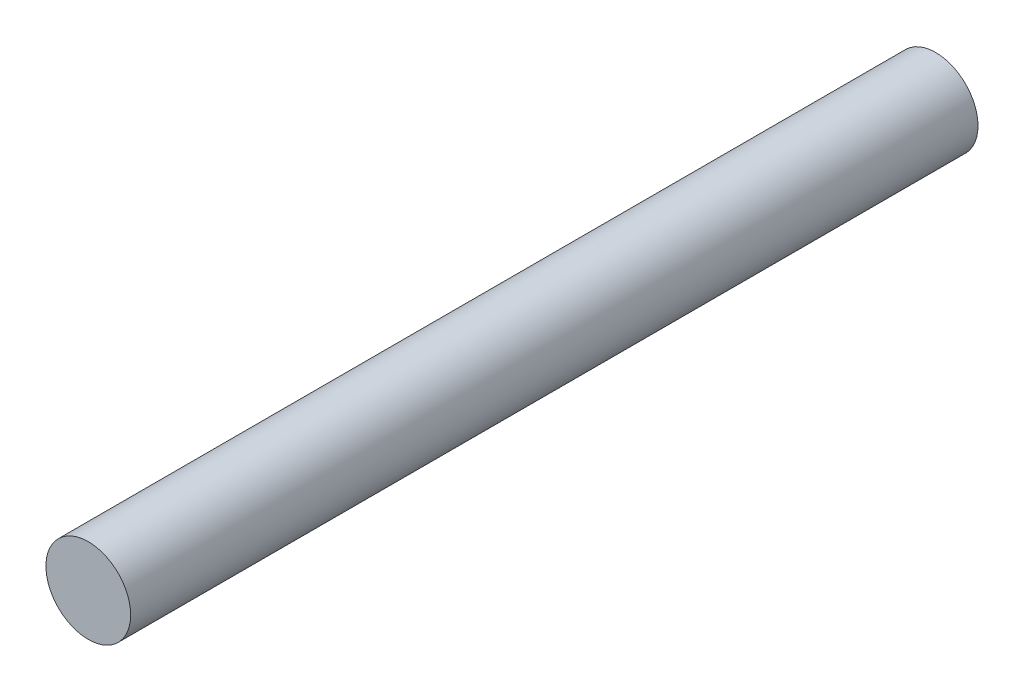
ISO-10303-21;
HEADER;
FILE_DESCRIPTION(('STEP AP214'),'2;1');
FILE_NAME('part.step','',(''),(''),'','','');
FILE_SCHEMA(('AUTOMOTIVE_DESIGN { 1 0 10303 214 1 1 1 1 }'));
ENDSEC;
DATA;
#1=APPLICATION_CONTEXT('core data for automotive mechanical design processes');
#2=APPLICATION_PROTOCOL_DEFINITION('international standard','automotive_design',2000,#1);
#3=PRODUCT_CONTEXT('',#1,'mechanical');
#4=PRODUCT('Part','Part','',(#3));
#5=PRODUCT_RELATED_PRODUCT_CATEGORY('part','',(#4));
#6=PRODUCT_DEFINITION_FORMATION('','',#4);
#7=PRODUCT_DEFINITION_CONTEXT('part definition',#1,'design');
#8=PRODUCT_DEFINITION('design','',#6,#7);
#9=PRODUCT_DEFINITION_SHAPE('','',#8);
#10=(LENGTH_UNIT() NAMED_UNIT(*) SI_UNIT(.MILLI.,.METRE.));
#11=(NAMED_UNIT(*) PLANE_ANGLE_UNIT() SI_UNIT($,.RADIAN.));
#12=(NAMED_UNIT(*) SI_UNIT($,.STERADIAN.) SOLID_ANGLE_UNIT());
#13=UNCERTAINTY_MEASURE_WITH_UNIT(LENGTH_MEASURE(1.E-05),#10,'distance_accuracy_value','');
#14=(GEOMETRIC_REPRESENTATION_CONTEXT(3) GLOBAL_UNCERTAINTY_ASSIGNED_CONTEXT((#13)) GLOBAL_UNIT_ASSIGNED_CONTEXT((#10,
#11,#12)) REPRESENTATION_CONTEXT('',''));
#15=CARTESIAN_POINT('',(0.,0.,0.));
#16=DIRECTION('',(0.,0.,1.));
#17=DIRECTION('',(1.,0.,0.));
#18=AXIS2_PLACEMENT_3D('',#15,#16,#17);
#19=CARTESIAN_POINT('',(0.,0.,20.));
#20=DIRECTION('',(0.,0.,-1.));
#21=DIRECTION('',(-1.,0.,0.));
#22=AXIS2_PLACEMENT_3D('',#19,#20,#21);
#23=CYLINDRICAL_SURFACE('',#22,1.);
#24=CARTESIAN_POINT('',(0.,0.,20.));
#25=DIRECTION('',(0.,0.,1.));
#26=DIRECTION('',(1.,0.,0.));
#27=AXIS2_PLACEMENT_3D('',#24,#25,#26);
#28=CIRCLE('',#27,1.);
#29=CARTESIAN_POINT('',(1.,0.,20.));
#30=VERTEX_POINT('',#29);
#31=EDGE_CURVE('E10',#30,#30,#28,.T.);
#32=ORIENTED_EDGE('',*,*,#31,.F.);
#33=EDGE_LOOP('',(#32));
#34=FACE_BOUND('',#33,.T.);
#35=CARTESIAN_POINT('',(0.,0.,0.));
#36=DIRECTION('',(0.,0.,1.));
#37=DIRECTION('',(1.,0.,0.));
#38=AXIS2_PLACEMENT_3D('',#35,#36,#37);
#39=CIRCLE('',#38,1.);
#40=CARTESIAN_POINT('',(1.,0.,0.));
#41=VERTEX_POINT('',#40);
#42=EDGE_CURVE('E36',#41,#41,#39,.T.);
#43=ORIENTED_EDGE('',*,*,#42,.T.);
#44=EDGE_LOOP('',(#43));
#45=FACE_BOUND('',#44,.T.);
#46=ADVANCED_FACE('F33',(#34,#45),#23,.T.);
#47=CARTESIAN_POINT('',(0.,0.,20.));
#48=DIRECTION('',(0.,0.,1.));
#49=DIRECTION('',(1.,0.,0.));
#50=AXIS2_PLACEMENT_3D('',#47,#48,#49);
#51=PLANE('',#50);
#52=ORIENTED_EDGE('',*,*,#31,.T.);
#53=EDGE_LOOP('',(#52));
#54=FACE_BOUND('',#53,.T.);
#55=ADVANCED_FACE('F48',(#54),#51,.T.);
#56=CARTESIAN_POINT('',(0.,0.,0.));
#57=DIRECTION('',(0.,0.,1.));
#58=DIRECTION('',(1.,0.,0.));
#59=AXIS2_PLACEMENT_3D('',#56,#57,#58);
#60=PLANE('',#59);
#61=ORIENTED_EDGE('',*,*,#42,.F.);
#62=EDGE_LOOP('',(#61));
#63=FACE_BOUND('',#62,.T.);
#64=ADVANCED_FACE('F46',(#63),#60,.F.);
#65=CLOSED_SHELL('',(#46,#55,#64));
#66=MANIFOLD_SOLID_BREP('B2',#65);
#67=ADVANCED_BREP_SHAPE_REPRESENTATION('',(#18,#66),#14);
#68=SHAPE_DEFINITION_REPRESENTATION(#9,#67);
ENDSEC;
END-ISO-10303-21;
